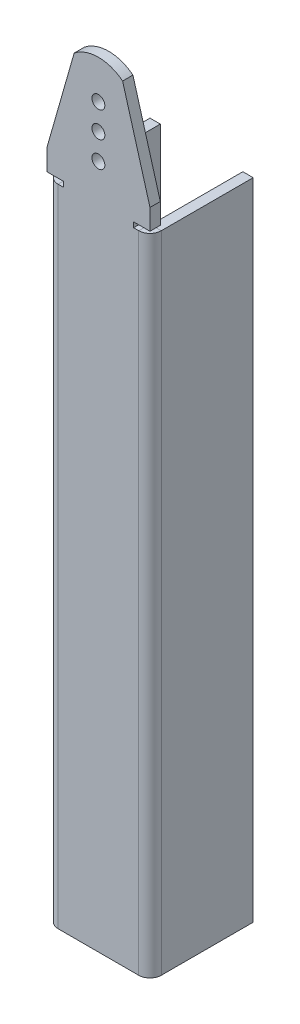
ISO-10303-21;
HEADER;
FILE_DESCRIPTION(('STEP AP214'),'2;1');
FILE_NAME('part.step','',(''),(''),'','','');
FILE_SCHEMA(('AUTOMOTIVE_DESIGN { 1 0 10303 214 1 1 1 1 }'));
ENDSEC;
DATA;
#1=APPLICATION_CONTEXT('core data for automotive mechanical design processes');
#2=APPLICATION_PROTOCOL_DEFINITION('international standard','automotive_design',2000,#1);
#3=PRODUCT_CONTEXT('',#1,'mechanical');
#4=PRODUCT('Part','Part','',(#3));
#5=PRODUCT_RELATED_PRODUCT_CATEGORY('part','',(#4));
#6=PRODUCT_DEFINITION_FORMATION('','',#4);
#7=PRODUCT_DEFINITION_CONTEXT('part definition',#1,'design');
#8=PRODUCT_DEFINITION('design','',#6,#7);
#9=PRODUCT_DEFINITION_SHAPE('','',#8);
#10=(LENGTH_UNIT() NAMED_UNIT(*) SI_UNIT(.MILLI.,.METRE.));
#11=(NAMED_UNIT(*) PLANE_ANGLE_UNIT() SI_UNIT($,.RADIAN.));
#12=(NAMED_UNIT(*) SI_UNIT($,.STERADIAN.) SOLID_ANGLE_UNIT());
#13=UNCERTAINTY_MEASURE_WITH_UNIT(LENGTH_MEASURE(1.E-05),#10,'distance_accuracy_value','');
#14=(GEOMETRIC_REPRESENTATION_CONTEXT(3) GLOBAL_UNCERTAINTY_ASSIGNED_CONTEXT((#13)) GLOBAL_UNIT_ASSIGNED_CONTEXT((#10,
#11,#12)) REPRESENTATION_CONTEXT('',''));
#15=CARTESIAN_POINT('',(0.,0.,0.));
#16=DIRECTION('',(0.,0.,1.));
#17=DIRECTION('',(1.,0.,0.));
#18=AXIS2_PLACEMENT_3D('',#15,#16,#17);
#19=CARTESIAN_POINT('',(39.9839854278637,570.877915043156,-8.));
#20=DIRECTION('',(0.,0.,-1.));
#21=DIRECTION('',(-1.,0.,0.));
#22=AXIS2_PLACEMENT_3D('',#19,#20,#21);
#23=PLANE('',#22);
#24=CARTESIAN_POINT('',(39.9839854278642,530.877915043156,-8.));
#25=DIRECTION('',(0.,0.,1.));
#26=DIRECTION('',(1.,0.,0.));
#27=AXIS2_PLACEMENT_3D('',#24,#25,#26);
#28=CIRCLE('',#27,5.);
#29=CARTESIAN_POINT('',(44.9839854278641,530.877915043156,-8.));
#30=VERTEX_POINT('',#29);
#31=EDGE_CURVE('E387',#30,#30,#28,.T.);
#32=ORIENTED_EDGE('',*,*,#31,.T.);
#33=EDGE_LOOP('',(#32));
#34=FACE_BOUND('',#33,.T.);
#35=CARTESIAN_POINT('',(39.9839854278639,550.877915043156,-8.));
#36=DIRECTION('',(0.,0.,1.));
#37=DIRECTION('',(1.,0.,0.));
#38=AXIS2_PLACEMENT_3D('',#35,#36,#37);
#39=CIRCLE('',#38,5.);
#40=CARTESIAN_POINT('',(44.9839854278639,550.877915043156,-8.));
#41=VERTEX_POINT('',#40);
#42=EDGE_CURVE('E393',#41,#41,#39,.T.);
#43=ORIENTED_EDGE('',*,*,#42,.T.);
#44=EDGE_LOOP('',(#43));
#45=FACE_BOUND('',#44,.T.);
#46=CARTESIAN_POINT('',(39.9839854278637,570.877915043156,-8.));
#47=DIRECTION('',(0.,0.,1.));
#48=DIRECTION('',(1.,0.,0.));
#49=AXIS2_PLACEMENT_3D('',#46,#47,#48);
#50=CIRCLE('',#49,5.);
#51=CARTESIAN_POINT('',(44.9839854278637,570.877915043156,-8.));
#52=VERTEX_POINT('',#51);
#53=EDGE_CURVE('E399',#52,#52,#50,.T.);
#54=ORIENTED_EDGE('',*,*,#53,.T.);
#55=EDGE_LOOP('',(#54));
#56=FACE_BOUND('',#55,.T.);
#57=DIRECTION('',(-1.,0.,0.));
#58=VECTOR('',#57,1.);
#59=CARTESIAN_POINT('',(71.2634,500.,-7.99999999999999));
#60=LINE('',#59,#58);
#61=CARTESIAN_POINT('',(71.2634,500.,-7.99999999999999));
#62=VERTEX_POINT('',#61);
#63=CARTESIAN_POINT('',(67.2634,500.,-7.99999999999999));
#64=VERTEX_POINT('',#63);
#65=EDGE_CURVE('E302',#62,#64,#60,.T.);
#66=ORIENTED_EDGE('',*,*,#65,.F.);
#67=DIRECTION('',(0.,-1.,0.));
#68=VECTOR('',#67,1.);
#69=CARTESIAN_POINT('',(71.2634,0.,-7.99999999999999));
#70=LINE('',#69,#68);
#71=CARTESIAN_POINT('',(71.2634,0.,-7.99999999999999));
#72=VERTEX_POINT('',#71);
#73=EDGE_CURVE('E292',#72,#62,#70,.F.);
#74=ORIENTED_EDGE('',*,*,#73,.F.);
#75=DIRECTION('',(1.,0.,0.));
#76=VECTOR('',#75,1.);
#77=CARTESIAN_POINT('',(0.,0.,-8.));
#78=LINE('',#77,#76);
#79=CARTESIAN_POINT('',(8.7366,0.,-8.));
#80=VERTEX_POINT('',#79);
#81=EDGE_CURVE('E408',#80,#72,#78,.T.);
#82=ORIENTED_EDGE('',*,*,#81,.F.);
#83=DIRECTION('',(0.,1.,0.));
#84=VECTOR('',#83,1.);
#85=CARTESIAN_POINT('',(8.7366,500.,-7.99999999999957));
#86=LINE('',#85,#84);
#87=CARTESIAN_POINT('',(8.7366,500.,-8.));
#88=VERTEX_POINT('',#87);
#89=EDGE_CURVE('E364',#88,#80,#86,.F.);
#90=ORIENTED_EDGE('',*,*,#89,.F.);
#91=DIRECTION('',(-1.,0.,0.));
#92=VECTOR('',#91,1.);
#93=CARTESIAN_POINT('',(12.7366,500.,-7.99999999999957));
#94=LINE('',#93,#92);
#95=CARTESIAN_POINT('',(12.7366,500.,-8.));
#96=VERTEX_POINT('',#95);
#97=EDGE_CURVE('E103',#96,#88,#94,.T.);
#98=ORIENTED_EDGE('',*,*,#97,.F.);
#99=DIRECTION('',(0.,-1.,0.));
#100=VECTOR('',#99,1.);
#101=CARTESIAN_POINT('',(12.7366,504.,-7.99999999999957));
#102=LINE('',#101,#100);
#103=CARTESIAN_POINT('',(12.7366,504.,-8.));
#104=VERTEX_POINT('',#103);
#105=EDGE_CURVE('E98',#104,#96,#102,.T.);
#106=ORIENTED_EDGE('',*,*,#105,.F.);
#107=DIRECTION('',(1.,0.,0.));
#108=VECTOR('',#107,1.);
#109=CARTESIAN_POINT('',(0.,504.,-7.99999999999978));
#110=LINE('',#109,#108);
#111=CARTESIAN_POINT('',(0.,504.,-8.));
#112=VERTEX_POINT('',#111);
#113=EDGE_CURVE('E374',#112,#104,#110,.T.);
#114=ORIENTED_EDGE('',*,*,#113,.F.);
#115=DIRECTION('',(0.,-1.,0.));
#116=VECTOR('',#115,1.);
#117=CARTESIAN_POINT('',(0.,0.,-8.));
#118=LINE('',#117,#116);
#119=CARTESIAN_POINT('',(0.,520.054307268096,-8.));
#120=VERTEX_POINT('',#119);
#121=EDGE_CURVE('E405',#120,#112,#118,.T.);
#122=ORIENTED_EDGE('',*,*,#121,.F.);
#123=DIRECTION('',(-0.274761416571079,-0.961512435678215,0.));
#124=VECTOR('',#123,1.);
#125=CARTESIAN_POINT('',(0.,520.054307268096,-8.));
#126=LINE('',#125,#124);
#127=CARTESIAN_POINT('',(21.2099630086313,594.277403973518,-8.));
#128=VERTEX_POINT('',#127);
#129=EDGE_CURVE('E420',#128,#120,#126,.T.);
#130=ORIENTED_EDGE('',*,*,#129,.F.);
#131=CARTESIAN_POINT('',(39.9839854278637,570.877915043156,-8.));
#132=DIRECTION('',(0.,0.,1.));
#133=DIRECTION('',(-1.,0.,0.));
#134=AXIS2_PLACEMENT_3D('',#131,#132,#133);
#135=CIRCLE('',#134,30.);
#136=CARTESIAN_POINT('',(58.7580078470961,594.277403973518,-8.));
#137=VERTEX_POINT('',#136);
#138=EDGE_CURVE('E417',#137,#128,#135,.T.);
#139=ORIENTED_EDGE('',*,*,#138,.F.);
#140=DIRECTION('',(-0.274958988502304,0.961455955643206,0.));
#141=VECTOR('',#140,1.);
#142=CARTESIAN_POINT('',(58.7580078470961,594.277403973518,-8.));
#143=LINE('',#142,#141);
#144=CARTESIAN_POINT('',(80.,520.,-8.));
#145=VERTEX_POINT('',#144);
#146=EDGE_CURVE('E414',#145,#137,#143,.T.);
#147=ORIENTED_EDGE('',*,*,#146,.F.);
#148=DIRECTION('',(0.,1.,0.));
#149=VECTOR('',#148,1.);
#150=CARTESIAN_POINT('',(80.,0.,-8.));
#151=LINE('',#150,#149);
#152=CARTESIAN_POINT('',(80.,504.,-7.99999999999999));
#153=VERTEX_POINT('',#152);
#154=EDGE_CURVE('E412',#153,#145,#151,.T.);
#155=ORIENTED_EDGE('',*,*,#154,.F.);
#156=DIRECTION('',(1.,0.,0.));
#157=VECTOR('',#156,1.);
#158=CARTESIAN_POINT('',(67.2634,504.,-7.99999999999999));
#159=LINE('',#158,#157);
#160=CARTESIAN_POINT('',(67.2634,504.,-7.99999999999999));
#161=VERTEX_POINT('',#160);
#162=EDGE_CURVE('E310',#161,#153,#159,.T.);
#163=ORIENTED_EDGE('',*,*,#162,.F.);
#164=DIRECTION('',(0.,1.,0.));
#165=VECTOR('',#164,1.);
#166=CARTESIAN_POINT('',(67.2634,500.,-7.99999999999999));
#167=LINE('',#166,#165);
#168=EDGE_CURVE('E306',#64,#161,#167,.T.);
#169=ORIENTED_EDGE('',*,*,#168,.F.);
#170=EDGE_LOOP('',(#66,#74,#82,#90,#98,#106,#114,#122,#130,#139,#147,#155,#163,#169));
#171=FACE_BOUND('',#170,.T.);
#172=ADVANCED_FACE('F83',(#34,#45,#56,#171),#23,.T.);
#173=CARTESIAN_POINT('',(39.9839854278637,570.877915043156,0.));
#174=DIRECTION('',(0.,0.,-1.));
#175=DIRECTION('',(-1.,0.,0.));
#176=AXIS2_PLACEMENT_3D('',#173,#174,#175);
#177=PLANE('',#176);
#178=CARTESIAN_POINT('',(39.9839854278642,530.877915043156,0.));
#179=DIRECTION('',(0.,0.,1.));
#180=DIRECTION('',(1.,0.,0.));
#181=AXIS2_PLACEMENT_3D('',#178,#179,#180);
#182=CIRCLE('',#181,5.);
#183=CARTESIAN_POINT('',(44.9839854278641,530.877915043156,0.));
#184=VERTEX_POINT('',#183);
#185=EDGE_CURVE('E377',#184,#184,#182,.T.);
#186=ORIENTED_EDGE('',*,*,#185,.F.);
#187=EDGE_LOOP('',(#186));
#188=FACE_BOUND('',#187,.T.);
#189=CARTESIAN_POINT('',(39.9839854278639,550.877915043156,0.));
#190=DIRECTION('',(0.,0.,1.));
#191=DIRECTION('',(1.,0.,0.));
#192=AXIS2_PLACEMENT_3D('',#189,#190,#191);
#193=CIRCLE('',#192,5.);
#194=CARTESIAN_POINT('',(44.9839854278639,550.877915043156,0.));
#195=VERTEX_POINT('',#194);
#196=EDGE_CURVE('E390',#195,#195,#193,.T.);
#197=ORIENTED_EDGE('',*,*,#196,.F.);
#198=EDGE_LOOP('',(#197));
#199=FACE_BOUND('',#198,.T.);
#200=CARTESIAN_POINT('',(39.9839854278637,570.877915043156,0.));
#201=DIRECTION('',(0.,0.,1.));
#202=DIRECTION('',(1.,0.,0.));
#203=AXIS2_PLACEMENT_3D('',#200,#201,#202);
#204=CIRCLE('',#203,5.);
#205=CARTESIAN_POINT('',(44.9839854278637,570.877915043156,0.));
#206=VERTEX_POINT('',#205);
#207=EDGE_CURVE('E396',#206,#206,#204,.T.);
#208=ORIENTED_EDGE('',*,*,#207,.F.);
#209=EDGE_LOOP('',(#208));
#210=FACE_BOUND('',#209,.T.);
#211=DIRECTION('',(0.,-1.,0.));
#212=VECTOR('',#211,1.);
#213=CARTESIAN_POINT('',(71.2634,0.,0.));
#214=LINE('',#213,#212);
#215=CARTESIAN_POINT('',(71.2634,0.,0.));
#216=VERTEX_POINT('',#215);
#217=CARTESIAN_POINT('',(71.2634,500.,0.));
#218=VERTEX_POINT('',#217);
#219=EDGE_CURVE('E238',#216,#218,#214,.F.);
#220=ORIENTED_EDGE('',*,*,#219,.T.);
#221=DIRECTION('',(1.,0.,0.));
#222=VECTOR('',#221,1.);
#223=CARTESIAN_POINT('',(39.9839854278637,500.,0.));
#224=LINE('',#223,#222);
#225=CARTESIAN_POINT('',(67.2634,500.,0.));
#226=VERTEX_POINT('',#225);
#227=EDGE_CURVE('E13',#226,#218,#224,.T.);
#228=ORIENTED_EDGE('',*,*,#227,.F.);
#229=DIRECTION('',(0.,-1.,0.));
#230=VECTOR('',#229,1.);
#231=CARTESIAN_POINT('',(67.2634,570.877915043156,0.));
#232=LINE('',#231,#230);
#233=CARTESIAN_POINT('',(67.2634,504.,0.));
#234=VERTEX_POINT('',#233);
#235=EDGE_CURVE('E91',#234,#226,#232,.T.);
#236=ORIENTED_EDGE('',*,*,#235,.F.);
#237=DIRECTION('',(-1.,0.,0.));
#238=VECTOR('',#237,1.);
#239=CARTESIAN_POINT('',(39.9839854278637,504.,0.));
#240=LINE('',#239,#238);
#241=CARTESIAN_POINT('',(80.,504.,0.));
#242=VERTEX_POINT('',#241);
#243=EDGE_CURVE('E305',#242,#234,#240,.T.);
#244=ORIENTED_EDGE('',*,*,#243,.F.);
#245=DIRECTION('',(0.,1.,0.));
#246=VECTOR('',#245,1.);
#247=CARTESIAN_POINT('',(80.,0.,0.));
#248=LINE('',#247,#246);
#249=CARTESIAN_POINT('',(80.,520.,0.));
#250=VERTEX_POINT('',#249);
#251=EDGE_CURVE('E428',#242,#250,#248,.T.);
#252=ORIENTED_EDGE('',*,*,#251,.T.);
#253=DIRECTION('',(-0.274958988502304,0.961455955643206,0.));
#254=VECTOR('',#253,1.);
#255=CARTESIAN_POINT('',(58.7580078470961,594.277403973518,0.));
#256=LINE('',#255,#254);
#257=CARTESIAN_POINT('',(58.7580078470961,594.277403973518,0.));
#258=VERTEX_POINT('',#257);
#259=EDGE_CURVE('E430',#250,#258,#256,.T.);
#260=ORIENTED_EDGE('',*,*,#259,.T.);
#261=CARTESIAN_POINT('',(39.9839854278637,570.877915043156,0.));
#262=DIRECTION('',(0.,0.,1.));
#263=DIRECTION('',(-1.,0.,0.));
#264=AXIS2_PLACEMENT_3D('',#261,#262,#263);
#265=CIRCLE('',#264,30.);
#266=CARTESIAN_POINT('',(21.2099630086313,594.277403973518,0.));
#267=VERTEX_POINT('',#266);
#268=EDGE_CURVE('E433',#258,#267,#265,.T.);
#269=ORIENTED_EDGE('',*,*,#268,.T.);
#270=DIRECTION('',(-0.274761416571079,-0.961512435678215,0.));
#271=VECTOR('',#270,1.);
#272=CARTESIAN_POINT('',(0.,520.054307268096,0.));
#273=LINE('',#272,#271);
#274=CARTESIAN_POINT('',(0.,520.054307268096,0.));
#275=VERTEX_POINT('',#274);
#276=EDGE_CURVE('E409',#267,#275,#273,.T.);
#277=ORIENTED_EDGE('',*,*,#276,.T.);
#278=DIRECTION('',(0.,-1.,0.));
#279=VECTOR('',#278,1.);
#280=CARTESIAN_POINT('',(0.,0.,0.));
#281=LINE('',#280,#279);
#282=CARTESIAN_POINT('',(0.,504.,0.));
#283=VERTEX_POINT('',#282);
#284=EDGE_CURVE('E402',#275,#283,#281,.T.);
#285=ORIENTED_EDGE('',*,*,#284,.T.);
#286=DIRECTION('',(-1.,0.,0.));
#287=VECTOR('',#286,1.);
#288=CARTESIAN_POINT('',(39.9839854278637,504.,0.));
#289=LINE('',#288,#287);
#290=CARTESIAN_POINT('',(12.7366,504.,0.));
#291=VERTEX_POINT('',#290);
#292=EDGE_CURVE('E452',#291,#283,#289,.T.);
#293=ORIENTED_EDGE('',*,*,#292,.F.);
#294=DIRECTION('',(0.,1.,0.));
#295=VECTOR('',#294,1.);
#296=CARTESIAN_POINT('',(12.7366,570.877915043156,0.));
#297=LINE('',#296,#295);
#298=CARTESIAN_POINT('',(12.7366,500.,0.));
#299=VERTEX_POINT('',#298);
#300=EDGE_CURVE('E449',#299,#291,#297,.T.);
#301=ORIENTED_EDGE('',*,*,#300,.F.);
#302=DIRECTION('',(1.,0.,0.));
#303=VECTOR('',#302,1.);
#304=CARTESIAN_POINT('',(39.9839854278637,500.,0.));
#305=LINE('',#304,#303);
#306=CARTESIAN_POINT('',(8.7366,500.,4.33680868994202E-13));
#307=VERTEX_POINT('',#306);
#308=EDGE_CURVE('E440',#307,#299,#305,.T.);
#309=ORIENTED_EDGE('',*,*,#308,.F.);
#310=DIRECTION('',(0.,1.,0.));
#311=VECTOR('',#310,1.);
#312=CARTESIAN_POINT('',(8.7366,500.,4.33680868994202E-13));
#313=LINE('',#312,#311);
#314=CARTESIAN_POINT('',(8.7366,0.,0.));
#315=VERTEX_POINT('',#314);
#316=EDGE_CURVE('E352',#307,#315,#313,.F.);
#317=ORIENTED_EDGE('',*,*,#316,.T.);
#318=DIRECTION('',(1.,0.,0.));
#319=VECTOR('',#318,1.);
#320=CARTESIAN_POINT('',(0.,0.,0.));
#321=LINE('',#320,#319);
#322=EDGE_CURVE('E426',#315,#216,#321,.T.);
#323=ORIENTED_EDGE('',*,*,#322,.T.);
#324=EDGE_LOOP('',(#220,#228,#236,#244,#252,#260,#269,#277,#285,#293,#301,#309,#317,#323));
#325=FACE_BOUND('',#324,.T.);
#326=ADVANCED_FACE('F464',(#188,#199,#210,#325),#177,.F.);
#327=CARTESIAN_POINT('',(80.,0.,-8.));
#328=DIRECTION('',(1.,0.,0.));
#329=DIRECTION('',(0.,0.,-1.));
#330=AXIS2_PLACEMENT_3D('',#327,#328,#329);
#331=PLANE('',#330);
#332=ORIENTED_EDGE('',*,*,#251,.F.);
#333=DIRECTION('',(0.,0.,1.));
#334=VECTOR('',#333,1.);
#335=CARTESIAN_POINT('',(80.,504.,-7.99999999999999));
#336=LINE('',#335,#334);
#337=EDGE_CURVE('E312',#153,#242,#336,.T.);
#338=ORIENTED_EDGE('',*,*,#337,.F.);
#339=ORIENTED_EDGE('',*,*,#154,.T.);
#340=DIRECTION('',(0.,0.,1.));
#341=VECTOR('',#340,1.);
#342=CARTESIAN_POINT('',(80.,520.,-8.));
#343=LINE('',#342,#341);
#344=EDGE_CURVE('E423',#145,#250,#343,.T.);
#345=ORIENTED_EDGE('',*,*,#344,.T.);
#346=EDGE_LOOP('',(#332,#338,#339,#345));
#347=FACE_BOUND('',#346,.T.);
#348=ADVANCED_FACE('F498',(#347),#331,.T.);
#349=CARTESIAN_POINT('',(0.,0.,-8.));
#350=DIRECTION('',(0.,-1.,0.));
#351=DIRECTION('',(0.,0.,-1.));
#352=AXIS2_PLACEMENT_3D('',#349,#350,#351);
#353=PLANE('',#352);
#354=ORIENTED_EDGE('',*,*,#81,.T.);
#355=DIRECTION('',(0.,0.,1.));
#356=VECTOR('',#355,1.);
#357=CARTESIAN_POINT('',(71.2634,0.,-7.99999999999999));
#358=LINE('',#357,#356);
#359=EDGE_CURVE('E288',#72,#216,#358,.T.);
#360=ORIENTED_EDGE('',*,*,#359,.T.);
#361=ORIENTED_EDGE('',*,*,#322,.F.);
#362=DIRECTION('',(0.,0.,1.));
#363=VECTOR('',#362,1.);
#364=CARTESIAN_POINT('',(8.7366,0.,-8.00000000000015));
#365=LINE('',#364,#363);
#366=EDGE_CURVE('E369',#80,#315,#365,.T.);
#367=ORIENTED_EDGE('',*,*,#366,.F.);
#368=EDGE_LOOP('',(#354,#360,#361,#367));
#369=FACE_BOUND('',#368,.T.);
#370=ADVANCED_FACE('F519',(#369),#353,.T.);
#371=CARTESIAN_POINT('',(0.,0.,-8.));
#372=DIRECTION('',(-1.,0.,0.));
#373=DIRECTION('',(0.,0.,1.));
#374=AXIS2_PLACEMENT_3D('',#371,#372,#373);
#375=PLANE('',#374);
#376=ORIENTED_EDGE('',*,*,#121,.T.);
#377=DIRECTION('',(0.,0.,1.));
#378=VECTOR('',#377,1.);
#379=CARTESIAN_POINT('',(0.,504.,-7.99999999999978));
#380=LINE('',#379,#378);
#381=EDGE_CURVE('E378',#112,#283,#380,.T.);
#382=ORIENTED_EDGE('',*,*,#381,.T.);
#383=ORIENTED_EDGE('',*,*,#284,.F.);
#384=DIRECTION('',(0.,0.,1.));
#385=VECTOR('',#384,1.);
#386=CARTESIAN_POINT('',(0.,520.054307268096,-8.));
#387=LINE('',#386,#385);
#388=EDGE_CURVE('E438',#120,#275,#387,.T.);
#389=ORIENTED_EDGE('',*,*,#388,.F.);
#390=EDGE_LOOP('',(#376,#382,#383,#389));
#391=FACE_BOUND('',#390,.T.);
#392=ADVANCED_FACE('F85',(#391),#375,.T.);
#393=CARTESIAN_POINT('',(0.,520.054307268096,-8.));
#394=DIRECTION('',(-0.961512435678215,0.274761416571079,0.));
#395=DIRECTION('',(-0.274761416571079,-0.961512435678216,0.));
#396=AXIS2_PLACEMENT_3D('',#393,#394,#395);
#397=PLANE('',#396);
#398=ORIENTED_EDGE('',*,*,#276,.F.);
#399=DIRECTION('',(0.,0.,1.));
#400=VECTOR('',#399,1.);
#401=CARTESIAN_POINT('',(21.2099630086313,594.277403973518,-8.));
#402=LINE('',#401,#400);
#403=EDGE_CURVE('E441',#128,#267,#402,.T.);
#404=ORIENTED_EDGE('',*,*,#403,.F.);
#405=ORIENTED_EDGE('',*,*,#129,.T.);
#406=ORIENTED_EDGE('',*,*,#388,.T.);
#407=EDGE_LOOP('',(#398,#404,#405,#406));
#408=FACE_BOUND('',#407,.T.);
#409=ADVANCED_FACE('F506',(#408),#397,.T.);
#410=CARTESIAN_POINT('',(39.9839854278637,570.877915043156,-8.));
#411=DIRECTION('',(0.,0.,1.));
#412=DIRECTION('',(1.,0.,0.));
#413=AXIS2_PLACEMENT_3D('',#410,#411,#412);
#414=CYLINDRICAL_SURFACE('',#413,30.);
#415=ORIENTED_EDGE('',*,*,#268,.F.);
#416=DIRECTION('',(0.,0.,1.));
#417=VECTOR('',#416,1.);
#418=CARTESIAN_POINT('',(58.7580078470961,594.277403973518,-8.));
#419=LINE('',#418,#417);
#420=EDGE_CURVE('E443',#137,#258,#419,.T.);
#421=ORIENTED_EDGE('',*,*,#420,.F.);
#422=ORIENTED_EDGE('',*,*,#138,.T.);
#423=ORIENTED_EDGE('',*,*,#403,.T.);
#424=EDGE_LOOP('',(#415,#421,#422,#423));
#425=FACE_BOUND('',#424,.T.);
#426=ADVANCED_FACE('F509',(#425),#414,.T.);
#427=CARTESIAN_POINT('',(58.7580078470961,594.277403973518,-8.));
#428=DIRECTION('',(0.961455955643206,0.274958988502304,0.));
#429=DIRECTION('',(-0.274958988502304,0.961455955643206,0.));
#430=AXIS2_PLACEMENT_3D('',#427,#428,#429);
#431=PLANE('',#430);
#432=ORIENTED_EDGE('',*,*,#259,.F.);
#433=ORIENTED_EDGE('',*,*,#344,.F.);
#434=ORIENTED_EDGE('',*,*,#146,.T.);
#435=ORIENTED_EDGE('',*,*,#420,.T.);
#436=EDGE_LOOP('',(#432,#433,#434,#435));
#437=FACE_BOUND('',#436,.T.);
#438=ADVANCED_FACE('F513',(#437),#431,.T.);
#439=CARTESIAN_POINT('',(39.9839854278637,570.877915043156,-8.));
#440=DIRECTION('',(0.,0.,1.));
#441=DIRECTION('',(1.,0.,0.));
#442=AXIS2_PLACEMENT_3D('',#439,#440,#441);
#443=CYLINDRICAL_SURFACE('',#442,5.);
#444=ORIENTED_EDGE('',*,*,#53,.F.);
#445=EDGE_LOOP('',(#444));
#446=FACE_BOUND('',#445,.T.);
#447=ORIENTED_EDGE('',*,*,#207,.T.);
#448=EDGE_LOOP('',(#447));
#449=FACE_BOUND('',#448,.T.);
#450=ADVANCED_FACE('F503',(#446,#449),#443,.F.);
#451=CARTESIAN_POINT('',(39.9839854278639,550.877915043156,-8.));
#452=DIRECTION('',(0.,0.,1.));
#453=DIRECTION('',(1.,0.,0.));
#454=AXIS2_PLACEMENT_3D('',#451,#452,#453);
#455=CYLINDRICAL_SURFACE('',#454,5.);
#456=ORIENTED_EDGE('',*,*,#42,.F.);
#457=EDGE_LOOP('',(#456));
#458=FACE_BOUND('',#457,.T.);
#459=ORIENTED_EDGE('',*,*,#196,.T.);
#460=EDGE_LOOP('',(#459));
#461=FACE_BOUND('',#460,.T.);
#462=ADVANCED_FACE('F588',(#458,#461),#455,.F.);
#463=CARTESIAN_POINT('',(39.9839854278642,530.877915043156,-8.));
#464=DIRECTION('',(0.,0.,1.));
#465=DIRECTION('',(1.,0.,0.));
#466=AXIS2_PLACEMENT_3D('',#463,#464,#465);
#467=CYLINDRICAL_SURFACE('',#466,5.);
#468=ORIENTED_EDGE('',*,*,#31,.F.);
#469=EDGE_LOOP('',(#468));
#470=FACE_BOUND('',#469,.T.);
#471=ORIENTED_EDGE('',*,*,#185,.T.);
#472=EDGE_LOOP('',(#471));
#473=FACE_BOUND('',#472,.T.);
#474=ADVANCED_FACE('F585',(#470,#473),#467,.F.);
#475=CARTESIAN_POINT('',(0.,504.,-7.99999999999978));
#476=DIRECTION('',(0.,-1.,0.));
#477=DIRECTION('',(0.,0.,-1.));
#478=AXIS2_PLACEMENT_3D('',#475,#476,#477);
#479=PLANE('',#478);
#480=DIRECTION('',(0.,0.,1.));
#481=VECTOR('',#480,1.);
#482=CARTESIAN_POINT('',(12.7366,504.,-7.99999999999957));
#483=LINE('',#482,#481);
#484=EDGE_CURVE('E380',#104,#291,#483,.T.);
#485=ORIENTED_EDGE('',*,*,#484,.T.);
#486=ORIENTED_EDGE('',*,*,#292,.T.);
#487=ORIENTED_EDGE('',*,*,#381,.F.);
#488=ORIENTED_EDGE('',*,*,#113,.T.);
#489=EDGE_LOOP('',(#485,#486,#487,#488));
#490=FACE_BOUND('',#489,.T.);
#491=ADVANCED_FACE('F581',(#490),#479,.T.);
#492=CARTESIAN_POINT('',(12.7366,504.,-7.99999999999957));
#493=DIRECTION('',(-1.,0.,0.));
#494=DIRECTION('',(0.,0.,1.));
#495=AXIS2_PLACEMENT_3D('',#492,#493,#494);
#496=PLANE('',#495);
#497=DIRECTION('',(0.,0.,1.));
#498=VECTOR('',#497,1.);
#499=CARTESIAN_POINT('',(12.7366,500.,-7.99999999999957));
#500=LINE('',#499,#498);
#501=EDGE_CURVE('E372',#96,#299,#500,.T.);
#502=ORIENTED_EDGE('',*,*,#501,.T.);
#503=ORIENTED_EDGE('',*,*,#300,.T.);
#504=ORIENTED_EDGE('',*,*,#484,.F.);
#505=ORIENTED_EDGE('',*,*,#105,.T.);
#506=EDGE_LOOP('',(#502,#503,#504,#505));
#507=FACE_BOUND('',#506,.T.);
#508=ADVANCED_FACE('F578',(#507),#496,.T.);
#509=CARTESIAN_POINT('',(12.7366,500.,-7.99999999999957));
#510=DIRECTION('',(0.,1.,0.));
#511=DIRECTION('',(0.,0.,1.));
#512=AXIS2_PLACEMENT_3D('',#509,#510,#511);
#513=PLANE('',#512);
#514=DIRECTION('',(0.,0.,1.));
#515=VECTOR('',#514,1.);
#516=CARTESIAN_POINT('',(8.7366,500.,-7.99999999999957));
#517=LINE('',#516,#515);
#518=EDGE_CURVE('E358',#88,#307,#517,.T.);
#519=ORIENTED_EDGE('',*,*,#518,.T.);
#520=ORIENTED_EDGE('',*,*,#308,.T.);
#521=ORIENTED_EDGE('',*,*,#501,.F.);
#522=ORIENTED_EDGE('',*,*,#97,.T.);
#523=EDGE_LOOP('',(#519,#520,#521,#522));
#524=FACE_BOUND('',#523,.T.);
#525=ADVANCED_FACE('F559',(#524),#513,.T.);
#526=CARTESIAN_POINT('',(8.7366,0.,-8.73660000000016));
#527=DIRECTION('',(0.,-1.,0.));
#528=DIRECTION('',(0.,0.,-1.));
#529=AXIS2_PLACEMENT_3D('',#526,#527,#528);
#530=PLANE('',#529);
#531=DIRECTION('',(-1.,0.,0.));
#532=VECTOR('',#531,1.);
#533=CARTESIAN_POINT('',(0.,0.,-8.73659999999997));
#534=LINE('',#533,#532);
#535=CARTESIAN_POINT('',(8.,0.,-8.73660000000015));
#536=VERTEX_POINT('',#535);
#537=CARTESIAN_POINT('',(0.,0.,-8.73660000000012));
#538=VERTEX_POINT('',#537);
#539=EDGE_CURVE('E319',#536,#538,#534,.T.);
#540=ORIENTED_EDGE('',*,*,#539,.F.);
#541=CARTESIAN_POINT('',(8.7366,0.,-8.73660000000016));
#542=DIRECTION('',(0.,1.,0.));
#543=DIRECTION('',(0.,0.,1.));
#544=AXIS2_PLACEMENT_3D('',#541,#542,#543);
#545=CIRCLE('',#544,0.7366);
#546=EDGE_CURVE('E361',#80,#536,#545,.F.);
#547=ORIENTED_EDGE('',*,*,#546,.F.);
#548=ORIENTED_EDGE('',*,*,#366,.T.);
#549=CARTESIAN_POINT('',(8.7366,0.,-8.73660000000016));
#550=DIRECTION('',(0.,1.,0.));
#551=DIRECTION('',(0.,0.,1.));
#552=AXIS2_PLACEMENT_3D('',#549,#550,#551);
#553=CIRCLE('',#552,8.7366);
#554=EDGE_CURVE('E354',#315,#538,#553,.F.);
#555=ORIENTED_EDGE('',*,*,#554,.T.);
#556=EDGE_LOOP('',(#540,#547,#548,#555));
#557=FACE_BOUND('',#556,.T.);
#558=ADVANCED_FACE('F534',(#557),#530,.T.);
#559=CARTESIAN_POINT('',(8.7366,500.,-8.73659999999957));
#560=DIRECTION('',(0.,-1.,0.));
#561=DIRECTION('',(0.,0.,-1.));
#562=AXIS2_PLACEMENT_3D('',#559,#560,#561);
#563=PLANE('',#562);
#564=CARTESIAN_POINT('',(8.7366,500.,-8.73659999999957));
#565=DIRECTION('',(0.,1.,0.));
#566=DIRECTION('',(0.,0.,1.));
#567=AXIS2_PLACEMENT_3D('',#564,#565,#566);
#568=CIRCLE('',#567,0.7366);
#569=CARTESIAN_POINT('',(8.,500.,-8.73659999999957));
#570=VERTEX_POINT('',#569);
#571=EDGE_CURVE('E322',#570,#88,#568,.T.);
#572=ORIENTED_EDGE('',*,*,#571,.F.);
#573=DIRECTION('',(-1.,0.,0.));
#574=VECTOR('',#573,1.);
#575=CARTESIAN_POINT('',(8.,500.,-8.73659999999972));
#576=LINE('',#575,#574);
#577=CARTESIAN_POINT('',(0.,500.,-8.73659999999969));
#578=VERTEX_POINT('',#577);
#579=EDGE_CURVE('E345',#570,#578,#576,.T.);
#580=ORIENTED_EDGE('',*,*,#579,.T.);
#581=CARTESIAN_POINT('',(8.7366,500.,-8.73659999999957));
#582=DIRECTION('',(0.,1.,0.));
#583=DIRECTION('',(0.,0.,1.));
#584=AXIS2_PLACEMENT_3D('',#581,#582,#583);
#585=CIRCLE('',#584,8.7366);
#586=EDGE_CURVE('E355',#578,#307,#585,.T.);
#587=ORIENTED_EDGE('',*,*,#586,.T.);
#588=ORIENTED_EDGE('',*,*,#518,.F.);
#589=EDGE_LOOP('',(#572,#580,#587,#588));
#590=FACE_BOUND('',#589,.T.);
#591=ADVANCED_FACE('F555',(#590),#563,.F.);
#592=CARTESIAN_POINT('',(8.7366,500.,-8.73659999999957));
#593=DIRECTION('',(0.,1.,0.));
#594=DIRECTION('',(-1.,0.,0.));
#595=AXIS2_PLACEMENT_3D('',#592,#593,#594);
#596=CYLINDRICAL_SURFACE('',#595,8.7366);
#597=ORIENTED_EDGE('',*,*,#316,.F.);
#598=ORIENTED_EDGE('',*,*,#586,.F.);
#599=DIRECTION('',(0.,1.,0.));
#600=VECTOR('',#599,1.);
#601=CARTESIAN_POINT('',(0.,0.,-8.73659999999997));
#602=LINE('',#601,#600);
#603=EDGE_CURVE('E342',#538,#578,#602,.T.);
#604=ORIENTED_EDGE('',*,*,#603,.F.);
#605=ORIENTED_EDGE('',*,*,#554,.F.);
#606=EDGE_LOOP('',(#597,#598,#604,#605));
#607=FACE_BOUND('',#606,.T.);
#608=ADVANCED_FACE('F562',(#607),#596,.T.);
#609=CARTESIAN_POINT('',(8.7366,500.,-8.73659999999957));
#610=DIRECTION('',(0.,1.,0.));
#611=DIRECTION('',(-1.,0.,0.));
#612=AXIS2_PLACEMENT_3D('',#609,#610,#611);
#613=CYLINDRICAL_SURFACE('',#612,0.7366);
#614=ORIENTED_EDGE('',*,*,#89,.T.);
#615=ORIENTED_EDGE('',*,*,#546,.T.);
#616=DIRECTION('',(0.,-1.,0.));
#617=VECTOR('',#616,1.);
#618=CARTESIAN_POINT('',(8.,0.,-8.7366));
#619=LINE('',#618,#617);
#620=EDGE_CURVE('E348',#536,#570,#619,.F.);
#621=ORIENTED_EDGE('',*,*,#620,.T.);
#622=ORIENTED_EDGE('',*,*,#571,.T.);
#623=EDGE_LOOP('',(#614,#615,#621,#622));
#624=FACE_BOUND('',#623,.T.);
#625=ADVANCED_FACE('F530',(#624),#613,.F.);
#626=CARTESIAN_POINT('',(0.,500.,-7.99999999999969));
#627=DIRECTION('',(0.,1.,0.));
#628=DIRECTION('',(0.,0.,1.));
#629=AXIS2_PLACEMENT_3D('',#626,#627,#628);
#630=PLANE('',#629);
#631=DIRECTION('',(0.,0.,1.));
#632=VECTOR('',#631,1.);
#633=CARTESIAN_POINT('',(0.,500.,-7.99999999999969));
#634=LINE('',#633,#632);
#635=CARTESIAN_POINT('',(-2.51562931491822E-13,500.,-80.));
#636=VERTEX_POINT('',#635);
#637=EDGE_CURVE('E326',#636,#578,#634,.T.);
#638=ORIENTED_EDGE('',*,*,#637,.T.);
#639=ORIENTED_EDGE('',*,*,#579,.F.);
#640=DIRECTION('',(0.,0.,-1.));
#641=VECTOR('',#640,1.);
#642=CARTESIAN_POINT('',(8.00000000000003,500.,0.));
#643=LINE('',#642,#641);
#644=CARTESIAN_POINT('',(7.99999999999975,500.,-80.));
#645=VERTEX_POINT('',#644);
#646=EDGE_CURVE('E334',#645,#570,#643,.F.);
#647=ORIENTED_EDGE('',*,*,#646,.F.);
#648=DIRECTION('',(1.,0.,0.));
#649=VECTOR('',#648,1.);
#650=CARTESIAN_POINT('',(-2.51534904016637E-13,500.,-80.));
#651=LINE('',#650,#649);
#652=EDGE_CURVE('E320',#636,#645,#651,.T.);
#653=ORIENTED_EDGE('',*,*,#652,.F.);
#654=EDGE_LOOP('',(#638,#639,#647,#653));
#655=FACE_BOUND('',#654,.T.);
#656=ADVANCED_FACE('F553',(#655),#630,.T.);
#657=CARTESIAN_POINT('',(-2.51534904016637E-13,0.,-80.));
#658=DIRECTION('',(0.,-1.,0.));
#659=DIRECTION('',(0.,0.,-1.));
#660=AXIS2_PLACEMENT_3D('',#657,#658,#659);
#661=PLANE('',#660);
#662=DIRECTION('',(0.,0.,1.));
#663=VECTOR('',#662,1.);
#664=CARTESIAN_POINT('',(8.00000000000003,0.,0.));
#665=LINE('',#664,#663);
#666=CARTESIAN_POINT('',(7.99999999999975,0.,-80.));
#667=VERTEX_POINT('',#666);
#668=EDGE_CURVE('E340',#536,#667,#665,.F.);
#669=ORIENTED_EDGE('',*,*,#668,.F.);
#670=ORIENTED_EDGE('',*,*,#539,.T.);
#671=DIRECTION('',(0.,0.,-1.));
#672=VECTOR('',#671,1.);
#673=CARTESIAN_POINT('',(-2.51562931491822E-13,0.,-80.));
#674=LINE('',#673,#672);
#675=CARTESIAN_POINT('',(-2.51562931491822E-13,0.,-80.));
#676=VERTEX_POINT('',#675);
#677=EDGE_CURVE('E332',#538,#676,#674,.T.);
#678=ORIENTED_EDGE('',*,*,#677,.T.);
#679=DIRECTION('',(1.,0.,0.));
#680=VECTOR('',#679,1.);
#681=CARTESIAN_POINT('',(-2.51534904016637E-13,0.,-80.));
#682=LINE('',#681,#680);
#683=EDGE_CURVE('E323',#676,#667,#682,.T.);
#684=ORIENTED_EDGE('',*,*,#683,.T.);
#685=EDGE_LOOP('',(#669,#670,#678,#684));
#686=FACE_BOUND('',#685,.T.);
#687=ADVANCED_FACE('F539',(#686),#661,.T.);
#688=CARTESIAN_POINT('',(0.,0.,0.));
#689=DIRECTION('',(-1.,0.,0.));
#690=DIRECTION('',(0.,0.,1.));
#691=AXIS2_PLACEMENT_3D('',#688,#689,#690);
#692=PLANE('',#691);
#693=ORIENTED_EDGE('',*,*,#677,.F.);
#694=ORIENTED_EDGE('',*,*,#603,.T.);
#695=ORIENTED_EDGE('',*,*,#637,.F.);
#696=DIRECTION('',(0.,1.,0.));
#697=VECTOR('',#696,1.);
#698=CARTESIAN_POINT('',(-2.51562931491822E-13,500.,-80.));
#699=LINE('',#698,#697);
#700=EDGE_CURVE('E329',#676,#636,#699,.T.);
#701=ORIENTED_EDGE('',*,*,#700,.F.);
#702=EDGE_LOOP('',(#693,#694,#695,#701));
#703=FACE_BOUND('',#702,.T.);
#704=ADVANCED_FACE('F543',(#703),#692,.T.);
#705=CARTESIAN_POINT('',(8.00000000000003,0.,0.));
#706=DIRECTION('',(-1.,0.,0.));
#707=DIRECTION('',(0.,0.,1.));
#708=AXIS2_PLACEMENT_3D('',#705,#706,#707);
#709=PLANE('',#708);
#710=ORIENTED_EDGE('',*,*,#620,.F.);
#711=ORIENTED_EDGE('',*,*,#668,.T.);
#712=DIRECTION('',(0.,-1.,0.));
#713=VECTOR('',#712,1.);
#714=CARTESIAN_POINT('',(7.99999999999975,0.,-80.));
#715=LINE('',#714,#713);
#716=EDGE_CURVE('E337',#667,#645,#715,.F.);
#717=ORIENTED_EDGE('',*,*,#716,.T.);
#718=ORIENTED_EDGE('',*,*,#646,.T.);
#719=EDGE_LOOP('',(#710,#711,#717,#718));
#720=FACE_BOUND('',#719,.T.);
#721=ADVANCED_FACE('F550',(#720),#709,.F.);
#722=CARTESIAN_POINT('',(-2.51534904016637E-13,500.,-80.));
#723=DIRECTION('',(0.,0.,-1.));
#724=DIRECTION('',(-1.,0.,0.));
#725=AXIS2_PLACEMENT_3D('',#722,#723,#724);
#726=PLANE('',#725);
#727=ORIENTED_EDGE('',*,*,#716,.F.);
#728=ORIENTED_EDGE('',*,*,#683,.F.);
#729=ORIENTED_EDGE('',*,*,#700,.T.);
#730=ORIENTED_EDGE('',*,*,#652,.T.);
#731=EDGE_LOOP('',(#727,#728,#729,#730));
#732=FACE_BOUND('',#731,.T.);
#733=ADVANCED_FACE('F547',(#732),#726,.T.);
#734=CARTESIAN_POINT('',(71.2634,500.,-7.99999999999999));
#735=DIRECTION('',(0.,1.,0.));
#736=DIRECTION('',(0.,0.,1.));
#737=AXIS2_PLACEMENT_3D('',#734,#735,#736);
#738=PLANE('',#737);
#739=DIRECTION('',(0.,0.,1.));
#740=VECTOR('',#739,1.);
#741=CARTESIAN_POINT('',(67.2634,500.,-7.99999999999999));
#742=LINE('',#741,#740);
#743=EDGE_CURVE('E309',#64,#226,#742,.T.);
#744=ORIENTED_EDGE('',*,*,#743,.T.);
#745=ORIENTED_EDGE('',*,*,#227,.T.);
#746=DIRECTION('',(0.,0.,1.));
#747=VECTOR('',#746,1.);
#748=CARTESIAN_POINT('',(71.2634,500.,-7.99999999999999));
#749=LINE('',#748,#747);
#750=EDGE_CURVE('E296',#62,#218,#749,.T.);
#751=ORIENTED_EDGE('',*,*,#750,.F.);
#752=ORIENTED_EDGE('',*,*,#65,.T.);
#753=EDGE_LOOP('',(#744,#745,#751,#752));
#754=FACE_BOUND('',#753,.T.);
#755=ADVANCED_FACE('F461',(#754),#738,.T.);
#756=CARTESIAN_POINT('',(67.2634,500.,-7.99999999999999));
#757=DIRECTION('',(1.,0.,0.));
#758=DIRECTION('',(0.,0.,-1.));
#759=AXIS2_PLACEMENT_3D('',#756,#757,#758);
#760=PLANE('',#759);
#761=DIRECTION('',(0.,0.,1.));
#762=VECTOR('',#761,1.);
#763=CARTESIAN_POINT('',(67.2634,504.,-7.99999999999999));
#764=LINE('',#763,#762);
#765=EDGE_CURVE('E299',#161,#234,#764,.T.);
#766=ORIENTED_EDGE('',*,*,#765,.T.);
#767=ORIENTED_EDGE('',*,*,#235,.T.);
#768=ORIENTED_EDGE('',*,*,#743,.F.);
#769=ORIENTED_EDGE('',*,*,#168,.T.);
#770=EDGE_LOOP('',(#766,#767,#768,#769));
#771=FACE_BOUND('',#770,.T.);
#772=ADVANCED_FACE('F456',(#771),#760,.T.);
#773=CARTESIAN_POINT('',(67.2634,504.,-7.99999999999999));
#774=DIRECTION('',(0.,-1.,0.));
#775=DIRECTION('',(0.,0.,-1.));
#776=AXIS2_PLACEMENT_3D('',#773,#774,#775);
#777=PLANE('',#776);
#778=ORIENTED_EDGE('',*,*,#337,.T.);
#779=ORIENTED_EDGE('',*,*,#243,.T.);
#780=ORIENTED_EDGE('',*,*,#765,.F.);
#781=ORIENTED_EDGE('',*,*,#162,.T.);
#782=EDGE_LOOP('',(#778,#779,#780,#781));
#783=FACE_BOUND('',#782,.T.);
#784=ADVANCED_FACE('F789',(#783),#777,.T.);
#785=CARTESIAN_POINT('',(71.2634,500.,-8.73659999999999));
#786=DIRECTION('',(0.,1.,0.));
#787=DIRECTION('',(0.,0.,1.));
#788=AXIS2_PLACEMENT_3D('',#785,#786,#787);
#789=PLANE('',#788);
#790=DIRECTION('',(1.,0.,0.));
#791=VECTOR('',#790,1.);
#792=CARTESIAN_POINT('',(80.,500.,-8.73659999999997));
#793=LINE('',#792,#791);
#794=CARTESIAN_POINT('',(72.,500.,-8.73659999999999));
#795=VERTEX_POINT('',#794);
#796=CARTESIAN_POINT('',(80.,500.,-8.73659999999997));
#797=VERTEX_POINT('',#796);
#798=EDGE_CURVE('E283',#795,#797,#793,.T.);
#799=ORIENTED_EDGE('',*,*,#798,.F.);
#800=CARTESIAN_POINT('',(71.2634,500.,-8.73659999999999));
#801=DIRECTION('',(0.,-1.,0.));
#802=DIRECTION('',(0.,0.,-1.));
#803=AXIS2_PLACEMENT_3D('',#800,#801,#802);
#804=CIRCLE('',#803,0.736600000000004);
#805=EDGE_CURVE('E241',#62,#795,#804,.F.);
#806=ORIENTED_EDGE('',*,*,#805,.F.);
#807=ORIENTED_EDGE('',*,*,#750,.T.);
#808=CARTESIAN_POINT('',(71.2634,500.,-8.73659999999999));
#809=DIRECTION('',(0.,-1.,0.));
#810=DIRECTION('',(0.,0.,-1.));
#811=AXIS2_PLACEMENT_3D('',#808,#809,#810);
#812=CIRCLE('',#811,8.7366);
#813=EDGE_CURVE('E287',#218,#797,#812,.F.);
#814=ORIENTED_EDGE('',*,*,#813,.T.);
#815=EDGE_LOOP('',(#799,#806,#807,#814));
#816=FACE_BOUND('',#815,.T.);
#817=ADVANCED_FACE('F468',(#816),#789,.T.);
#818=CARTESIAN_POINT('',(71.2634,0.,-8.73659999999999));
#819=DIRECTION('',(0.,1.,0.));
#820=DIRECTION('',(0.,0.,1.));
#821=AXIS2_PLACEMENT_3D('',#818,#819,#820);
#822=PLANE('',#821);
#823=CARTESIAN_POINT('',(71.2634,0.,-8.73659999999999));
#824=DIRECTION('',(0.,-1.,0.));
#825=DIRECTION('',(0.,0.,-1.));
#826=AXIS2_PLACEMENT_3D('',#823,#824,#825);
#827=CIRCLE('',#826,0.736600000000004);
#828=CARTESIAN_POINT('',(72.,0.,-8.73659999999999));
#829=VERTEX_POINT('',#828);
#830=EDGE_CURVE('E248',#829,#72,#827,.T.);
#831=ORIENTED_EDGE('',*,*,#830,.F.);
#832=DIRECTION('',(1.,0.,0.));
#833=VECTOR('',#832,1.);
#834=CARTESIAN_POINT('',(72.,0.,-8.73659999999998));
#835=LINE('',#834,#833);
#836=CARTESIAN_POINT('',(80.,0.,-8.73659999999995));
#837=VERTEX_POINT('',#836);
#838=EDGE_CURVE('E245',#829,#837,#835,.T.);
#839=ORIENTED_EDGE('',*,*,#838,.T.);
#840=CARTESIAN_POINT('',(71.2634,0.,-8.73659999999999));
#841=DIRECTION('',(0.,-1.,0.));
#842=DIRECTION('',(0.,0.,-1.));
#843=AXIS2_PLACEMENT_3D('',#840,#841,#842);
#844=CIRCLE('',#843,8.7366);
#845=EDGE_CURVE('E230',#837,#216,#844,.T.);
#846=ORIENTED_EDGE('',*,*,#845,.T.);
#847=ORIENTED_EDGE('',*,*,#359,.F.);
#848=EDGE_LOOP('',(#831,#839,#846,#847));
#849=FACE_BOUND('',#848,.T.);
#850=ADVANCED_FACE('F246',(#849),#822,.F.);
#851=CARTESIAN_POINT('',(71.2634,0.,-8.73659999999999));
#852=DIRECTION('',(0.,-1.,0.));
#853=DIRECTION('',(1.,0.,0.));
#854=AXIS2_PLACEMENT_3D('',#851,#852,#853);
#855=CYLINDRICAL_SURFACE('',#854,8.7366);
#856=ORIENTED_EDGE('',*,*,#219,.F.);
#857=ORIENTED_EDGE('',*,*,#845,.F.);
#858=DIRECTION('',(0.,-1.,0.));
#859=VECTOR('',#858,1.);
#860=CARTESIAN_POINT('',(80.,0.,-8.73659999999995));
#861=LINE('',#860,#859);
#862=EDGE_CURVE('E235',#797,#837,#861,.T.);
#863=ORIENTED_EDGE('',*,*,#862,.F.);
#864=ORIENTED_EDGE('',*,*,#813,.F.);
#865=EDGE_LOOP('',(#856,#857,#863,#864));
#866=FACE_BOUND('',#865,.T.);
#867=ADVANCED_FACE('F232',(#866),#855,.T.);
#868=CARTESIAN_POINT('',(71.2634,0.,-8.73659999999999));
#869=DIRECTION('',(0.,-1.,0.));
#870=DIRECTION('',(1.,0.,0.));
#871=AXIS2_PLACEMENT_3D('',#868,#869,#870);
#872=CYLINDRICAL_SURFACE('',#871,0.736600000000004);
#873=ORIENTED_EDGE('',*,*,#73,.T.);
#874=ORIENTED_EDGE('',*,*,#805,.T.);
#875=DIRECTION('',(0.,1.,0.));
#876=VECTOR('',#875,1.);
#877=CARTESIAN_POINT('',(72.,500.,-8.7366));
#878=LINE('',#877,#876);
#879=EDGE_CURVE('E253',#795,#829,#878,.F.);
#880=ORIENTED_EDGE('',*,*,#879,.T.);
#881=ORIENTED_EDGE('',*,*,#830,.T.);
#882=EDGE_LOOP('',(#873,#874,#880,#881));
#883=FACE_BOUND('',#882,.T.);
#884=ADVANCED_FACE('F472',(#883),#872,.F.);
#885=CARTESIAN_POINT('',(80.,0.,-7.99999999999997));
#886=DIRECTION('',(0.,-1.,0.));
#887=DIRECTION('',(0.,0.,-1.));
#888=AXIS2_PLACEMENT_3D('',#885,#886,#887);
#889=PLANE('',#888);
#890=DIRECTION('',(0.,0.,1.));
#891=VECTOR('',#890,1.);
#892=CARTESIAN_POINT('',(80.,0.,-7.99999999999997));
#893=LINE('',#892,#891);
#894=CARTESIAN_POINT('',(80.0000000000002,0.,-80.));
#895=VERTEX_POINT('',#894);
#896=EDGE_CURVE('E260',#895,#837,#893,.T.);
#897=ORIENTED_EDGE('',*,*,#896,.T.);
#898=ORIENTED_EDGE('',*,*,#838,.F.);
#899=DIRECTION('',(0.,0.,-1.));
#900=VECTOR('',#899,1.);
#901=CARTESIAN_POINT('',(72.,0.,2.77555756156289E-13));
#902=LINE('',#901,#900);
#903=CARTESIAN_POINT('',(72.0000000000003,0.,-80.));
#904=VERTEX_POINT('',#903);
#905=EDGE_CURVE('E276',#904,#829,#902,.F.);
#906=ORIENTED_EDGE('',*,*,#905,.F.);
#907=DIRECTION('',(-1.,0.,0.));
#908=VECTOR('',#907,1.);
#909=CARTESIAN_POINT('',(80.0000000000002,0.,-80.));
#910=LINE('',#909,#908);
#911=EDGE_CURVE('E265',#895,#904,#910,.T.);
#912=ORIENTED_EDGE('',*,*,#911,.F.);
#913=EDGE_LOOP('',(#897,#898,#906,#912));
#914=FACE_BOUND('',#913,.T.);
#915=ADVANCED_FACE('F264',(#914),#889,.T.);
#916=CARTESIAN_POINT('',(80.0000000000002,500.,-80.));
#917=DIRECTION('',(0.,1.,0.));
#918=DIRECTION('',(0.,0.,1.));
#919=AXIS2_PLACEMENT_3D('',#916,#917,#918);
#920=PLANE('',#919);
#921=DIRECTION('',(0.,0.,1.));
#922=VECTOR('',#921,1.);
#923=CARTESIAN_POINT('',(72.,500.,2.77555756156289E-13));
#924=LINE('',#923,#922);
#925=CARTESIAN_POINT('',(72.0000000000003,500.,-80.));
#926=VERTEX_POINT('',#925);
#927=EDGE_CURVE('E262',#795,#926,#924,.F.);
#928=ORIENTED_EDGE('',*,*,#927,.F.);
#929=ORIENTED_EDGE('',*,*,#798,.T.);
#930=DIRECTION('',(0.,0.,-1.));
#931=VECTOR('',#930,1.);
#932=CARTESIAN_POINT('',(80.0000000000002,500.,-80.));
#933=LINE('',#932,#931);
#934=CARTESIAN_POINT('',(80.0000000000002,500.,-80.));
#935=VERTEX_POINT('',#934);
#936=EDGE_CURVE('E261',#797,#935,#933,.T.);
#937=ORIENTED_EDGE('',*,*,#936,.T.);
#938=DIRECTION('',(-1.,0.,0.));
#939=VECTOR('',#938,1.);
#940=CARTESIAN_POINT('',(80.0000000000002,500.,-80.));
#941=LINE('',#940,#939);
#942=EDGE_CURVE('E267',#935,#926,#941,.T.);
#943=ORIENTED_EDGE('',*,*,#942,.T.);
#944=EDGE_LOOP('',(#928,#929,#937,#943));
#945=FACE_BOUND('',#944,.T.);
#946=ADVANCED_FACE('F478',(#945),#920,.T.);
#947=CARTESIAN_POINT('',(80.,0.,3.05487606867034E-13));
#948=DIRECTION('',(1.,0.,0.));
#949=DIRECTION('',(0.,0.,-1.));
#950=AXIS2_PLACEMENT_3D('',#947,#948,#949);
#951=PLANE('',#950);
#952=ORIENTED_EDGE('',*,*,#936,.F.);
#953=ORIENTED_EDGE('',*,*,#862,.T.);
#954=ORIENTED_EDGE('',*,*,#896,.F.);
#955=DIRECTION('',(0.,-1.,0.));
#956=VECTOR('',#955,1.);
#957=CARTESIAN_POINT('',(80.0000000000002,0.,-80.));
#958=LINE('',#957,#956);
#959=EDGE_CURVE('E268',#935,#895,#958,.T.);
#960=ORIENTED_EDGE('',*,*,#959,.F.);
#961=EDGE_LOOP('',(#952,#953,#954,#960));
#962=FACE_BOUND('',#961,.T.);
#963=ADVANCED_FACE('F258',(#962),#951,.T.);
#964=CARTESIAN_POINT('',(72.,0.,2.77555756156289E-13));
#965=DIRECTION('',(1.,0.,0.));
#966=DIRECTION('',(0.,0.,-1.));
#967=AXIS2_PLACEMENT_3D('',#964,#965,#966);
#968=PLANE('',#967);
#969=ORIENTED_EDGE('',*,*,#879,.F.);
#970=ORIENTED_EDGE('',*,*,#927,.T.);
#971=DIRECTION('',(0.,1.,0.));
#972=VECTOR('',#971,1.);
#973=CARTESIAN_POINT('',(72.0000000000003,0.,-80.));
#974=LINE('',#973,#972);
#975=EDGE_CURVE('E278',#926,#904,#974,.F.);
#976=ORIENTED_EDGE('',*,*,#975,.T.);
#977=ORIENTED_EDGE('',*,*,#905,.T.);
#978=EDGE_LOOP('',(#969,#970,#976,#977));
#979=FACE_BOUND('',#978,.T.);
#980=ADVANCED_FACE('F476',(#979),#968,.F.);
#981=CARTESIAN_POINT('',(80.0000000000002,0.,-80.));
#982=DIRECTION('',(0.,0.,-1.));
#983=DIRECTION('',(-1.,0.,0.));
#984=AXIS2_PLACEMENT_3D('',#981,#982,#983);
#985=PLANE('',#984);
#986=ORIENTED_EDGE('',*,*,#975,.F.);
#987=ORIENTED_EDGE('',*,*,#942,.F.);
#988=ORIENTED_EDGE('',*,*,#959,.T.);
#989=ORIENTED_EDGE('',*,*,#911,.T.);
#990=EDGE_LOOP('',(#986,#987,#988,#989));
#991=FACE_BOUND('',#990,.T.);
#992=ADVANCED_FACE('F482',(#991),#985,.T.);
#993=CLOSED_SHELL('',(#172,#326,#348,#370,#392,#409,#426,#438,#450,#462,#474,#491,#508,#525,
#558,#591,#608,#625,#656,#687,#704,#721,#733,#755,#772,#784,#817,#850,#867,#884,#915,#946,#963,
#980,#992));
#994=MANIFOLD_SOLID_BREP('B2',#993);
#995=ADVANCED_BREP_SHAPE_REPRESENTATION('',(#18,#994),#14);
#996=SHAPE_DEFINITION_REPRESENTATION(#9,#995);
ENDSEC;
END-ISO-10303-21;
